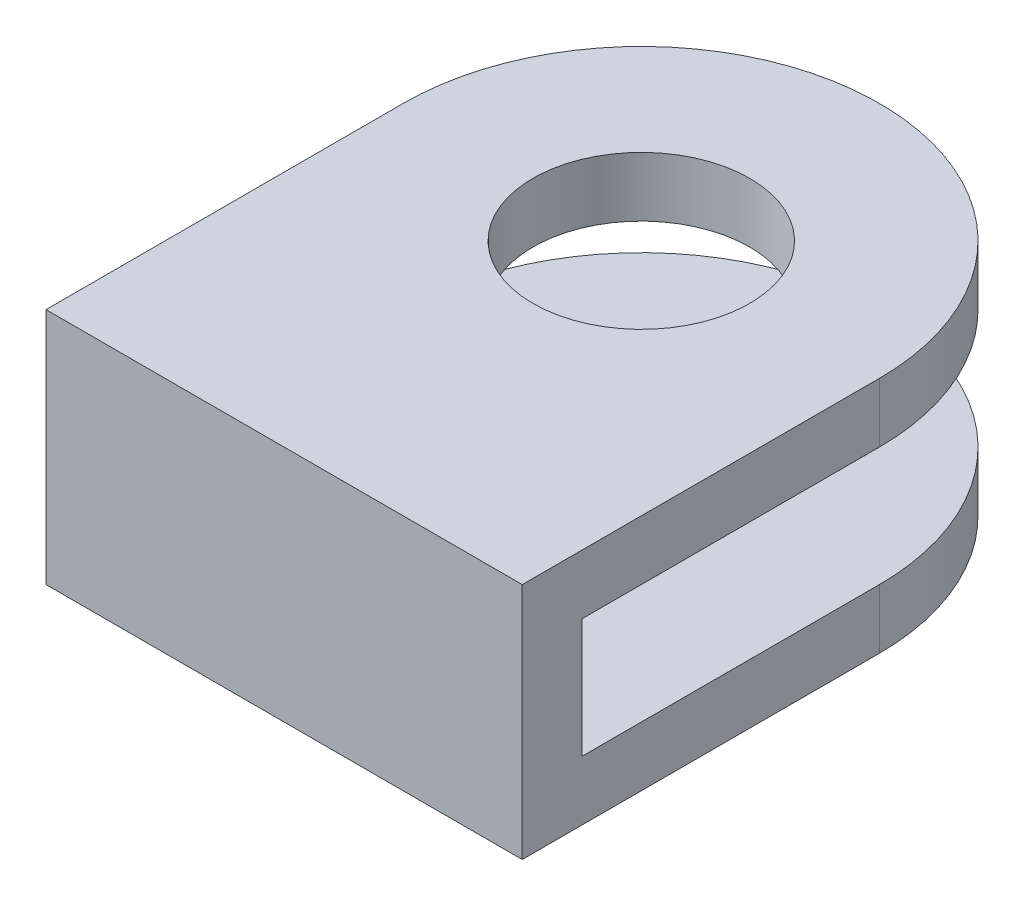
ISO-10303-21;
HEADER;
FILE_DESCRIPTION(('STEP AP214'),'2;1');
FILE_NAME('part.step','',(''),(''),'','','');
FILE_SCHEMA(('AUTOMOTIVE_DESIGN { 1 0 10303 214 1 1 1 1 }'));
ENDSEC;
DATA;
#1=APPLICATION_CONTEXT('core data for automotive mechanical design processes');
#2=APPLICATION_PROTOCOL_DEFINITION('international standard','automotive_design',2000,#1);
#3=PRODUCT_CONTEXT('',#1,'mechanical');
#4=PRODUCT('Part','Part','',(#3));
#5=PRODUCT_RELATED_PRODUCT_CATEGORY('part','',(#4));
#6=PRODUCT_DEFINITION_FORMATION('','',#4);
#7=PRODUCT_DEFINITION_CONTEXT('part definition',#1,'design');
#8=PRODUCT_DEFINITION('design','',#6,#7);
#9=PRODUCT_DEFINITION_SHAPE('','',#8);
#10=(LENGTH_UNIT() NAMED_UNIT(*) SI_UNIT(.MILLI.,.METRE.));
#11=(NAMED_UNIT(*) PLANE_ANGLE_UNIT() SI_UNIT($,.RADIAN.));
#12=(NAMED_UNIT(*) SI_UNIT($,.STERADIAN.) SOLID_ANGLE_UNIT());
#13=UNCERTAINTY_MEASURE_WITH_UNIT(LENGTH_MEASURE(1.E-05),#10,'distance_accuracy_value','');
#14=(GEOMETRIC_REPRESENTATION_CONTEXT(3) GLOBAL_UNCERTAINTY_ASSIGNED_CONTEXT((#13)) GLOBAL_UNIT_ASSIGNED_CONTEXT((#10,
#11,#12)) REPRESENTATION_CONTEXT('',''));
#15=CARTESIAN_POINT('',(0.,0.,0.));
#16=DIRECTION('',(0.,0.,1.));
#17=DIRECTION('',(1.,0.,0.));
#18=AXIS2_PLACEMENT_3D('',#15,#16,#17);
#19=CARTESIAN_POINT('',(-62.115859099697,12.7,-9.52499999999999));
#20=DIRECTION('',(1.,0.,0.));
#21=DIRECTION('',(0.,0.,-1.));
#22=AXIS2_PLACEMENT_3D('',#19,#20,#21);
#23=PLANE('',#22);
#24=DIRECTION('',(0.,0.,1.));
#25=VECTOR('',#24,1.);
#26=CARTESIAN_POINT('',(-62.115859099697,3.175,-9.52499999999999));
#27=LINE('',#26,#25);
#28=CARTESIAN_POINT('',(-62.115859099697,3.175,-28.575));
#29=VERTEX_POINT('',#28);
#30=CARTESIAN_POINT('',(-62.115859099697,3.175,-12.7));
#31=VERTEX_POINT('',#30);
#32=EDGE_CURVE('E161',#29,#31,#27,.T.);
#33=ORIENTED_EDGE('',*,*,#32,.F.);
#34=DIRECTION('',(0.,-1.,0.));
#35=VECTOR('',#34,1.);
#36=CARTESIAN_POINT('',(-62.115859099697,12.7,-28.575));
#37=LINE('',#36,#35);
#38=CARTESIAN_POINT('',(-62.115859099697,0.,-28.575));
#39=VERTEX_POINT('',#38);
#40=EDGE_CURVE('E93',#29,#39,#37,.T.);
#41=ORIENTED_EDGE('',*,*,#40,.T.);
#42=DIRECTION('',(0.,0.,1.));
#43=VECTOR('',#42,1.);
#44=CARTESIAN_POINT('',(-62.115859099697,0.,-9.52499999999999));
#45=LINE('',#44,#43);
#46=CARTESIAN_POINT('',(-62.115859099697,0.,-9.52499999999999));
#47=VERTEX_POINT('',#46);
#48=EDGE_CURVE('E171',#39,#47,#45,.T.);
#49=ORIENTED_EDGE('',*,*,#48,.T.);
#50=DIRECTION('',(0.,-1.,0.));
#51=VECTOR('',#50,1.);
#52=CARTESIAN_POINT('',(-62.115859099697,12.7,-9.52499999999999));
#53=LINE('',#52,#51);
#54=CARTESIAN_POINT('',(-62.115859099697,12.7,-9.52499999999999));
#55=VERTEX_POINT('',#54);
#56=EDGE_CURVE('E11',#55,#47,#53,.T.);
#57=ORIENTED_EDGE('',*,*,#56,.F.);
#58=DIRECTION('',(0.,0.,1.));
#59=VECTOR('',#58,1.);
#60=CARTESIAN_POINT('',(-62.115859099697,12.7,-9.52499999999999));
#61=LINE('',#60,#59);
#62=CARTESIAN_POINT('',(-62.115859099697,12.7,-28.575));
#63=VERTEX_POINT('',#62);
#64=EDGE_CURVE('E175',#63,#55,#61,.T.);
#65=ORIENTED_EDGE('',*,*,#64,.F.);
#66=CARTESIAN_POINT('',(-62.115859099697,9.525,-28.575));
#67=VERTEX_POINT('',#66);
#68=EDGE_CURVE('E197',#63,#67,#37,.T.);
#69=ORIENTED_EDGE('',*,*,#68,.T.);
#70=DIRECTION('',(0.,0.,-1.));
#71=VECTOR('',#70,1.);
#72=CARTESIAN_POINT('',(-62.115859099697,9.525,-9.52499999999999));
#73=LINE('',#72,#71);
#74=CARTESIAN_POINT('',(-62.115859099697,9.525,-12.7));
#75=VERTEX_POINT('',#74);
#76=EDGE_CURVE('E62',#75,#67,#73,.T.);
#77=ORIENTED_EDGE('',*,*,#76,.F.);
#78=DIRECTION('',(0.,1.,0.));
#79=VECTOR('',#78,1.);
#80=CARTESIAN_POINT('',(-62.115859099697,12.7,-12.7));
#81=LINE('',#80,#79);
#82=EDGE_CURVE('E130',#31,#75,#81,.T.);
#83=ORIENTED_EDGE('',*,*,#82,.F.);
#84=EDGE_LOOP('',(#33,#41,#49,#57,#65,#69,#77,#83));
#85=FACE_BOUND('',#84,.T.);
#86=ADVANCED_FACE('F45',(#85),#23,.F.);
#87=CARTESIAN_POINT('',(-36.715859099697,12.7,-28.575));
#88=DIRECTION('',(-1.,0.,0.));
#89=DIRECTION('',(0.,0.,1.));
#90=AXIS2_PLACEMENT_3D('',#87,#88,#89);
#91=PLANE('',#90);
#92=DIRECTION('',(0.,0.,1.));
#93=VECTOR('',#92,1.);
#94=CARTESIAN_POINT('',(-36.715859099697,3.175,0.));
#95=LINE('',#94,#93);
#96=CARTESIAN_POINT('',(-36.715859099697,3.175,-28.575));
#97=VERTEX_POINT('',#96);
#98=CARTESIAN_POINT('',(-36.715859099697,3.175,-12.7));
#99=VERTEX_POINT('',#98);
#100=EDGE_CURVE('E142',#97,#99,#95,.T.);
#101=ORIENTED_EDGE('',*,*,#100,.T.);
#102=DIRECTION('',(0.,1.,0.));
#103=VECTOR('',#102,1.);
#104=CARTESIAN_POINT('',(-36.715859099697,0.,-12.7));
#105=LINE('',#104,#103);
#106=CARTESIAN_POINT('',(-36.715859099697,9.525,-12.7));
#107=VERTEX_POINT('',#106);
#108=EDGE_CURVE('E127',#99,#107,#105,.T.);
#109=ORIENTED_EDGE('',*,*,#108,.T.);
#110=DIRECTION('',(0.,0.,-1.));
#111=VECTOR('',#110,1.);
#112=CARTESIAN_POINT('',(-36.715859099697,9.525,0.));
#113=LINE('',#112,#111);
#114=CARTESIAN_POINT('',(-36.715859099697,9.525,-28.575));
#115=VERTEX_POINT('',#114);
#116=EDGE_CURVE('E135',#107,#115,#113,.T.);
#117=ORIENTED_EDGE('',*,*,#116,.T.);
#118=DIRECTION('',(0.,-1.,0.));
#119=VECTOR('',#118,1.);
#120=CARTESIAN_POINT('',(-36.715859099697,12.7,-28.575));
#121=LINE('',#120,#119);
#122=CARTESIAN_POINT('',(-36.715859099697,12.7,-28.575));
#123=VERTEX_POINT('',#122);
#124=EDGE_CURVE('E202',#123,#115,#121,.T.);
#125=ORIENTED_EDGE('',*,*,#124,.F.);
#126=DIRECTION('',(0.,0.,-1.));
#127=VECTOR('',#126,1.);
#128=CARTESIAN_POINT('',(-36.715859099697,12.7,-28.575));
#129=LINE('',#128,#127);
#130=CARTESIAN_POINT('',(-36.715859099697,12.7,-9.525));
#131=VERTEX_POINT('',#130);
#132=EDGE_CURVE('E181',#131,#123,#129,.T.);
#133=ORIENTED_EDGE('',*,*,#132,.F.);
#134=DIRECTION('',(0.,-1.,0.));
#135=VECTOR('',#134,1.);
#136=CARTESIAN_POINT('',(-36.715859099697,12.7,-9.525));
#137=LINE('',#136,#135);
#138=CARTESIAN_POINT('',(-36.715859099697,0.,-9.525));
#139=VERTEX_POINT('',#138);
#140=EDGE_CURVE('E54',#131,#139,#137,.T.);
#141=ORIENTED_EDGE('',*,*,#140,.T.);
#142=DIRECTION('',(0.,0.,-1.));
#143=VECTOR('',#142,1.);
#144=CARTESIAN_POINT('',(-36.715859099697,0.,-28.575));
#145=LINE('',#144,#143);
#146=CARTESIAN_POINT('',(-36.715859099697,0.,-28.575));
#147=VERTEX_POINT('',#146);
#148=EDGE_CURVE('E191',#139,#147,#145,.T.);
#149=ORIENTED_EDGE('',*,*,#148,.T.);
#150=EDGE_CURVE('E201',#97,#147,#121,.T.);
#151=ORIENTED_EDGE('',*,*,#150,.F.);
#152=EDGE_LOOP('',(#101,#109,#117,#125,#133,#141,#149,#151));
#153=FACE_BOUND('',#152,.T.);
#154=ADVANCED_FACE('F144',(#153),#91,.F.);
#155=CARTESIAN_POINT('',(-49.415859099697,12.7,-28.575));
#156=DIRECTION('',(0.,-1.,0.));
#157=DIRECTION('',(0.,0.,-1.));
#158=AXIS2_PLACEMENT_3D('',#155,#156,#157);
#159=CYLINDRICAL_SURFACE('',#158,12.7);
#160=CARTESIAN_POINT('',(-49.415859099697,3.175,-28.575));
#161=DIRECTION('',(0.,1.,0.));
#162=DIRECTION('',(0.,0.,1.));
#163=AXIS2_PLACEMENT_3D('',#160,#161,#162);
#164=CIRCLE('',#163,12.7);
#165=EDGE_CURVE('E158',#97,#29,#164,.T.);
#166=ORIENTED_EDGE('',*,*,#165,.F.);
#167=ORIENTED_EDGE('',*,*,#150,.T.);
#168=CARTESIAN_POINT('',(-49.415859099697,0.,-28.575));
#169=DIRECTION('',(0.,1.,0.));
#170=DIRECTION('',(0.,0.,1.));
#171=AXIS2_PLACEMENT_3D('',#168,#169,#170);
#172=CIRCLE('',#171,12.7);
#173=EDGE_CURVE('E178',#147,#39,#172,.T.);
#174=ORIENTED_EDGE('',*,*,#173,.T.);
#175=ORIENTED_EDGE('',*,*,#40,.F.);
#176=EDGE_LOOP('',(#166,#167,#174,#175));
#177=FACE_BOUND('',#176,.T.);
#178=ADVANCED_FACE('F227',(#177),#159,.T.);
#179=ORIENTED_EDGE('',*,*,#124,.T.);
#180=CARTESIAN_POINT('',(-49.415859099697,9.525,-28.575));
#181=DIRECTION('',(0.,-1.,0.));
#182=DIRECTION('',(0.,0.,-1.));
#183=AXIS2_PLACEMENT_3D('',#180,#181,#182);
#184=CIRCLE('',#183,12.7);
#185=EDGE_CURVE('E137',#67,#115,#184,.T.);
#186=ORIENTED_EDGE('',*,*,#185,.F.);
#187=ORIENTED_EDGE('',*,*,#68,.F.);
#188=CARTESIAN_POINT('',(-49.415859099697,12.7,-28.575));
#189=DIRECTION('',(0.,1.,0.));
#190=DIRECTION('',(0.,0.,1.));
#191=AXIS2_PLACEMENT_3D('',#188,#189,#190);
#192=CIRCLE('',#191,12.7);
#193=EDGE_CURVE('E71',#123,#63,#192,.T.);
#194=ORIENTED_EDGE('',*,*,#193,.F.);
#195=EDGE_LOOP('',(#179,#186,#187,#194));
#196=FACE_BOUND('',#195,.T.);
#197=ADVANCED_FACE('F241',(#196),#159,.T.);
#198=CARTESIAN_POINT('',(-49.415859099697,12.7,-28.575));
#199=DIRECTION('',(0.,-1.,0.));
#200=DIRECTION('',(0.,0.,-1.));
#201=AXIS2_PLACEMENT_3D('',#198,#199,#200);
#202=CYLINDRICAL_SURFACE('',#201,5.78131598025215);
#203=CARTESIAN_POINT('',(-49.415859099697,0.,-28.575));
#204=DIRECTION('',(0.,1.,0.));
#205=DIRECTION('',(0.,0.,1.));
#206=AXIS2_PLACEMENT_3D('',#203,#204,#205);
#207=CIRCLE('',#206,5.78131598025215);
#208=CARTESIAN_POINT('',(-49.415859099697,0.,-22.7936840197478));
#209=VERTEX_POINT('',#208);
#210=EDGE_CURVE('E166',#209,#209,#207,.T.);
#211=ORIENTED_EDGE('',*,*,#210,.F.);
#212=EDGE_LOOP('',(#211));
#213=FACE_BOUND('',#212,.T.);
#214=CARTESIAN_POINT('',(-49.415859099697,3.175,-28.575));
#215=DIRECTION('',(0.,1.,0.));
#216=DIRECTION('',(0.,0.,1.));
#217=AXIS2_PLACEMENT_3D('',#214,#215,#216);
#218=CIRCLE('',#217,5.78131598025215);
#219=CARTESIAN_POINT('',(-49.415859099697,3.175,-22.7936840197478));
#220=VERTEX_POINT('',#219);
#221=EDGE_CURVE('E48',#220,#220,#218,.T.);
#222=ORIENTED_EDGE('',*,*,#221,.T.);
#223=EDGE_LOOP('',(#222));
#224=FACE_BOUND('',#223,.T.);
#225=ADVANCED_FACE('F239',(#213,#224),#202,.F.);
#226=CARTESIAN_POINT('',(-49.415859099697,12.7,-28.575));
#227=DIRECTION('',(0.,1.,0.));
#228=DIRECTION('',(0.,0.,1.));
#229=AXIS2_PLACEMENT_3D('',#226,#227,#228);
#230=CIRCLE('',#229,5.78131598025215);
#231=CARTESIAN_POINT('',(-49.415859099697,12.7,-22.7936840197478));
#232=VERTEX_POINT('',#231);
#233=EDGE_CURVE('E167',#232,#232,#230,.T.);
#234=ORIENTED_EDGE('',*,*,#233,.T.);
#235=EDGE_LOOP('',(#234));
#236=FACE_BOUND('',#235,.T.);
#237=CARTESIAN_POINT('',(-49.415859099697,9.525,-28.575));
#238=DIRECTION('',(0.,-1.,0.));
#239=DIRECTION('',(0.,0.,-1.));
#240=AXIS2_PLACEMENT_3D('',#237,#238,#239);
#241=CIRCLE('',#240,5.78131598025215);
#242=CARTESIAN_POINT('',(-49.415859099697,9.525,-34.3563159802521));
#243=VERTEX_POINT('',#242);
#244=EDGE_CURVE('E152',#243,#243,#241,.T.);
#245=ORIENTED_EDGE('',*,*,#244,.T.);
#246=EDGE_LOOP('',(#245));
#247=FACE_BOUND('',#246,.T.);
#248=ADVANCED_FACE('F211',(#236,#247),#202,.F.);
#249=CARTESIAN_POINT('',(-49.415859099697,12.7,-28.575));
#250=DIRECTION('',(0.,1.,0.));
#251=DIRECTION('',(0.,0.,1.));
#252=AXIS2_PLACEMENT_3D('',#249,#250,#251);
#253=PLANE('',#252);
#254=ORIENTED_EDGE('',*,*,#64,.T.);
#255=DIRECTION('',(1.,0.,0.));
#256=VECTOR('',#255,1.);
#257=CARTESIAN_POINT('',(-36.715859099697,12.7,-9.525));
#258=LINE('',#257,#256);
#259=EDGE_CURVE('E100',#55,#131,#258,.T.);
#260=ORIENTED_EDGE('',*,*,#259,.T.);
#261=ORIENTED_EDGE('',*,*,#132,.T.);
#262=ORIENTED_EDGE('',*,*,#193,.T.);
#263=EDGE_LOOP('',(#254,#260,#261,#262));
#264=FACE_BOUND('',#263,.T.);
#265=ORIENTED_EDGE('',*,*,#233,.F.);
#266=EDGE_LOOP('',(#265));
#267=FACE_BOUND('',#266,.T.);
#268=ADVANCED_FACE('F248',(#264,#267),#253,.T.);
#269=CARTESIAN_POINT('',(-49.415859099697,0.,-28.575));
#270=DIRECTION('',(0.,1.,0.));
#271=DIRECTION('',(0.,0.,1.));
#272=AXIS2_PLACEMENT_3D('',#269,#270,#271);
#273=PLANE('',#272);
#274=ORIENTED_EDGE('',*,*,#48,.F.);
#275=ORIENTED_EDGE('',*,*,#173,.F.);
#276=ORIENTED_EDGE('',*,*,#148,.F.);
#277=DIRECTION('',(1.,0.,0.));
#278=VECTOR('',#277,1.);
#279=CARTESIAN_POINT('',(-36.715859099697,0.,-9.525));
#280=LINE('',#279,#278);
#281=EDGE_CURVE('E188',#47,#139,#280,.T.);
#282=ORIENTED_EDGE('',*,*,#281,.F.);
#283=EDGE_LOOP('',(#274,#275,#276,#282));
#284=FACE_BOUND('',#283,.T.);
#285=ORIENTED_EDGE('',*,*,#210,.T.);
#286=EDGE_LOOP('',(#285));
#287=FACE_BOUND('',#286,.T.);
#288=ADVANCED_FACE('F256',(#284,#287),#273,.F.);
#289=CARTESIAN_POINT('',(-36.715859099697,12.7,-9.525));
#290=DIRECTION('',(0.,0.,-1.));
#291=DIRECTION('',(-1.,0.,0.));
#292=AXIS2_PLACEMENT_3D('',#289,#290,#291);
#293=PLANE('',#292);
#294=ORIENTED_EDGE('',*,*,#281,.T.);
#295=ORIENTED_EDGE('',*,*,#140,.F.);
#296=ORIENTED_EDGE('',*,*,#259,.F.);
#297=ORIENTED_EDGE('',*,*,#56,.T.);
#298=EDGE_LOOP('',(#294,#295,#296,#297));
#299=FACE_BOUND('',#298,.T.);
#300=ADVANCED_FACE('F258',(#299),#293,.F.);
#301=CARTESIAN_POINT('',(-70.243859099697,0.,-12.7));
#302=DIRECTION('',(0.,0.,-1.));
#303=DIRECTION('',(-1.,0.,0.));
#304=AXIS2_PLACEMENT_3D('',#301,#302,#303);
#305=PLANE('',#304);
#306=ORIENTED_EDGE('',*,*,#82,.T.);
#307=DIRECTION('',(1.,0.,0.));
#308=VECTOR('',#307,1.);
#309=CARTESIAN_POINT('',(-70.243859099697,9.525,-12.7));
#310=LINE('',#309,#308);
#311=EDGE_CURVE('E122',#75,#107,#310,.T.);
#312=ORIENTED_EDGE('',*,*,#311,.T.);
#313=ORIENTED_EDGE('',*,*,#108,.F.);
#314=DIRECTION('',(1.,0.,0.));
#315=VECTOR('',#314,1.);
#316=CARTESIAN_POINT('',(-70.243859099697,3.175,-12.7));
#317=LINE('',#316,#315);
#318=EDGE_CURVE('E132',#31,#99,#317,.T.);
#319=ORIENTED_EDGE('',*,*,#318,.F.);
#320=EDGE_LOOP('',(#306,#312,#313,#319));
#321=FACE_BOUND('',#320,.T.);
#322=ADVANCED_FACE('F124',(#321),#305,.T.);
#323=CARTESIAN_POINT('',(-70.243859099697,3.175,0.));
#324=DIRECTION('',(0.,1.,0.));
#325=DIRECTION('',(0.,0.,1.));
#326=AXIS2_PLACEMENT_3D('',#323,#324,#325);
#327=PLANE('',#326);
#328=ORIENTED_EDGE('',*,*,#221,.F.);
#329=EDGE_LOOP('',(#328));
#330=FACE_BOUND('',#329,.T.);
#331=ORIENTED_EDGE('',*,*,#32,.T.);
#332=ORIENTED_EDGE('',*,*,#318,.T.);
#333=ORIENTED_EDGE('',*,*,#100,.F.);
#334=ORIENTED_EDGE('',*,*,#165,.T.);
#335=EDGE_LOOP('',(#331,#332,#333,#334));
#336=FACE_BOUND('',#335,.T.);
#337=ADVANCED_FACE('F214',(#330,#336),#327,.T.);
#338=CARTESIAN_POINT('',(-70.243859099697,9.525,0.));
#339=DIRECTION('',(0.,-1.,0.));
#340=DIRECTION('',(0.,0.,-1.));
#341=AXIS2_PLACEMENT_3D('',#338,#339,#340);
#342=PLANE('',#341);
#343=ORIENTED_EDGE('',*,*,#244,.F.);
#344=EDGE_LOOP('',(#343));
#345=FACE_BOUND('',#344,.T.);
#346=ORIENTED_EDGE('',*,*,#76,.T.);
#347=ORIENTED_EDGE('',*,*,#185,.T.);
#348=ORIENTED_EDGE('',*,*,#116,.F.);
#349=ORIENTED_EDGE('',*,*,#311,.F.);
#350=EDGE_LOOP('',(#346,#347,#348,#349));
#351=FACE_BOUND('',#350,.T.);
#352=ADVANCED_FACE('F136',(#345,#351),#342,.T.);
#353=CLOSED_SHELL('',(#86,#154,#178,#197,#225,#248,#268,#288,#300,#322,#337,#352));
#354=MANIFOLD_SOLID_BREP('B2',#353);
#355=ADVANCED_BREP_SHAPE_REPRESENTATION('',(#18,#354),#14);
#356=SHAPE_DEFINITION_REPRESENTATION(#9,#355);
ENDSEC;
END-ISO-10303-21;
